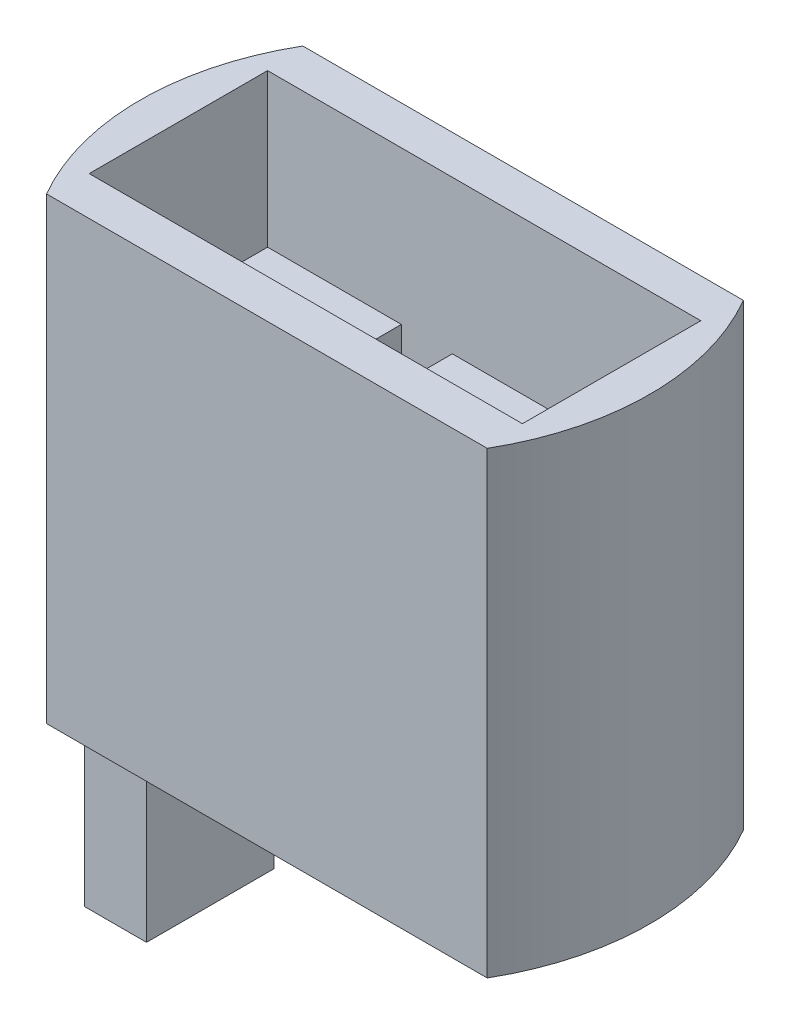
ISO-10303-21;
HEADER;
FILE_DESCRIPTION(('STEP AP214'),'2;1');
FILE_NAME('part.step','',(''),(''),'','','');
FILE_SCHEMA(('AUTOMOTIVE_DESIGN { 1 0 10303 214 1 1 1 1 }'));
ENDSEC;
DATA;
#1=APPLICATION_CONTEXT('core data for automotive mechanical design processes');
#2=APPLICATION_PROTOCOL_DEFINITION('international standard','automotive_design',2000,#1);
#3=PRODUCT_CONTEXT('',#1,'mechanical');
#4=PRODUCT('Part','Part','',(#3));
#5=PRODUCT_RELATED_PRODUCT_CATEGORY('part','',(#4));
#6=PRODUCT_DEFINITION_FORMATION('','',#4);
#7=PRODUCT_DEFINITION_CONTEXT('part definition',#1,'design');
#8=PRODUCT_DEFINITION('design','',#6,#7);
#9=PRODUCT_DEFINITION_SHAPE('','',#8);
#10=(LENGTH_UNIT() NAMED_UNIT(*) SI_UNIT(.MILLI.,.METRE.));
#11=(NAMED_UNIT(*) PLANE_ANGLE_UNIT() SI_UNIT($,.RADIAN.));
#12=(NAMED_UNIT(*) SI_UNIT($,.STERADIAN.) SOLID_ANGLE_UNIT());
#13=UNCERTAINTY_MEASURE_WITH_UNIT(LENGTH_MEASURE(1.E-05),#10,'distance_accuracy_value','');
#14=(GEOMETRIC_REPRESENTATION_CONTEXT(3) GLOBAL_UNCERTAINTY_ASSIGNED_CONTEXT((#13)) GLOBAL_UNIT_ASSIGNED_CONTEXT((#10,
#11,#12)) REPRESENTATION_CONTEXT('',''));
#15=CARTESIAN_POINT('',(0.,0.,0.));
#16=DIRECTION('',(0.,0.,1.));
#17=DIRECTION('',(1.,0.,0.));
#18=AXIS2_PLACEMENT_3D('',#15,#16,#17);
#19=CARTESIAN_POINT('',(-8.05,-8.,-2.5));
#20=DIRECTION('',(1.,0.,0.));
#21=DIRECTION('',(0.,0.,-1.));
#22=AXIS2_PLACEMENT_3D('',#19,#20,#21);
#23=PLANE('',#22);
#24=DIRECTION('',(0.,-1.,0.));
#25=VECTOR('',#24,1.);
#26=CARTESIAN_POINT('',(-8.05,-8.,1.5));
#27=LINE('',#26,#25);
#28=CARTESIAN_POINT('',(-8.05,-0.75,1.5));
#29=VERTEX_POINT('',#28);
#30=CARTESIAN_POINT('',(-8.05,-8.,1.5));
#31=VERTEX_POINT('',#30);
#32=EDGE_CURVE('E56',#29,#31,#27,.T.);
#33=ORIENTED_EDGE('',*,*,#32,.F.);
#34=DIRECTION('',(0.,0.,1.));
#35=VECTOR('',#34,1.);
#36=CARTESIAN_POINT('',(-8.05,-0.75,1.5));
#37=LINE('',#36,#35);
#38=CARTESIAN_POINT('',(-8.05,-0.75,-1.5));
#39=VERTEX_POINT('',#38);
#40=EDGE_CURVE('E464',#39,#29,#37,.T.);
#41=ORIENTED_EDGE('',*,*,#40,.F.);
#42=DIRECTION('',(0.,1.,0.));
#43=VECTOR('',#42,1.);
#44=CARTESIAN_POINT('',(-8.05,-0.75,-1.5));
#45=LINE('',#44,#43);
#46=CARTESIAN_POINT('',(-8.05,-8.,-1.5));
#47=VERTEX_POINT('',#46);
#48=EDGE_CURVE('E61',#47,#39,#45,.T.);
#49=ORIENTED_EDGE('',*,*,#48,.F.);
#50=DIRECTION('',(0.,0.,-1.));
#51=VECTOR('',#50,1.);
#52=CARTESIAN_POINT('',(-8.05,-8.,-2.5));
#53=LINE('',#52,#51);
#54=EDGE_CURVE('E203',#31,#47,#53,.T.);
#55=ORIENTED_EDGE('',*,*,#54,.F.);
#56=EDGE_LOOP('',(#33,#41,#49,#55));
#57=FACE_BOUND('',#56,.T.);
#58=ADVANCED_FACE('F41',(#57),#23,.F.);
#59=CARTESIAN_POINT('',(-8.05,-8.,-2.5));
#60=DIRECTION('',(0.,0.,1.));
#61=DIRECTION('',(1.,0.,0.));
#62=AXIS2_PLACEMENT_3D('',#59,#60,#61);
#63=PLANE('',#62);
#64=DIRECTION('',(1.,0.,0.));
#65=VECTOR('',#64,1.);
#66=CARTESIAN_POINT('',(-8.05,-8.,-2.5));
#67=LINE('',#66,#65);
#68=CARTESIAN_POINT('',(-9.68245836551854,-8.,-2.5));
#69=VERTEX_POINT('',#68);
#70=CARTESIAN_POINT('',(-7.25,-8.,-2.5));
#71=VERTEX_POINT('',#70);
#72=EDGE_CURVE('E193',#69,#71,#67,.T.);
#73=ORIENTED_EDGE('',*,*,#72,.F.);
#74=DIRECTION('',(0.,1.,0.));
#75=VECTOR('',#74,1.);
#76=CARTESIAN_POINT('',(-9.68245836551854,-8.001,-2.5));
#77=LINE('',#76,#75);
#78=CARTESIAN_POINT('',(-9.68245836551854,0.,-2.5));
#79=VERTEX_POINT('',#78);
#80=EDGE_CURVE('E176',#69,#79,#77,.T.);
#81=ORIENTED_EDGE('',*,*,#80,.T.);
#82=DIRECTION('',(1.,0.,0.));
#83=VECTOR('',#82,1.);
#84=CARTESIAN_POINT('',(-8.05,0.,-2.5));
#85=LINE('',#84,#83);
#86=CARTESIAN_POINT('',(-7.25,0.,-2.5));
#87=VERTEX_POINT('',#86);
#88=EDGE_CURVE('E214',#79,#87,#85,.T.);
#89=ORIENTED_EDGE('',*,*,#88,.T.);
#90=DIRECTION('',(0.,1.,0.));
#91=VECTOR('',#90,1.);
#92=CARTESIAN_POINT('',(-7.25,-8.,-2.5));
#93=LINE('',#92,#91);
#94=EDGE_CURVE('E11',#71,#87,#93,.T.);
#95=ORIENTED_EDGE('',*,*,#94,.F.);
#96=EDGE_LOOP('',(#73,#81,#89,#95));
#97=FACE_BOUND('',#96,.T.);
#98=ADVANCED_FACE('F199',(#97),#63,.F.);
#99=CARTESIAN_POINT('',(-7.25,-8.,-2.5));
#100=DIRECTION('',(-1.,0.,0.));
#101=DIRECTION('',(0.,0.,1.));
#102=AXIS2_PLACEMENT_3D('',#99,#100,#101);
#103=PLANE('',#102);
#104=DIRECTION('',(0.,0.,1.));
#105=VECTOR('',#104,1.);
#106=CARTESIAN_POINT('',(-7.25,0.,-2.5));
#107=LINE('',#106,#105);
#108=CARTESIAN_POINT('',(-7.25,0.,2.5));
#109=VERTEX_POINT('',#108);
#110=EDGE_CURVE('E217',#87,#109,#107,.T.);
#111=ORIENTED_EDGE('',*,*,#110,.T.);
#112=DIRECTION('',(0.,1.,0.));
#113=VECTOR('',#112,1.);
#114=CARTESIAN_POINT('',(-7.25,-8.,2.5));
#115=LINE('',#114,#113);
#116=CARTESIAN_POINT('',(-7.25,-8.,2.5));
#117=VERTEX_POINT('',#116);
#118=EDGE_CURVE('E49',#117,#109,#115,.T.);
#119=ORIENTED_EDGE('',*,*,#118,.F.);
#120=DIRECTION('',(0.,0.,1.));
#121=VECTOR('',#120,1.);
#122=CARTESIAN_POINT('',(-7.25,-8.,-2.5));
#123=LINE('',#122,#121);
#124=EDGE_CURVE('E202',#71,#117,#123,.T.);
#125=ORIENTED_EDGE('',*,*,#124,.F.);
#126=ORIENTED_EDGE('',*,*,#94,.T.);
#127=EDGE_LOOP('',(#111,#119,#125,#126));
#128=FACE_BOUND('',#127,.T.);
#129=ADVANCED_FACE('F423',(#128),#103,.F.);
#130=CARTESIAN_POINT('',(-8.05,-8.,2.5));
#131=DIRECTION('',(0.,0.,-1.));
#132=DIRECTION('',(-1.,0.,0.));
#133=AXIS2_PLACEMENT_3D('',#130,#131,#132);
#134=PLANE('',#133);
#135=DIRECTION('',(-1.,0.,0.));
#136=VECTOR('',#135,1.);
#137=CARTESIAN_POINT('',(-8.05,0.,2.5));
#138=LINE('',#137,#136);
#139=CARTESIAN_POINT('',(-9.68245836551854,0.,2.5));
#140=VERTEX_POINT('',#139);
#141=EDGE_CURVE('E208',#109,#140,#138,.T.);
#142=ORIENTED_EDGE('',*,*,#141,.T.);
#143=DIRECTION('',(0.,1.,0.));
#144=VECTOR('',#143,1.);
#145=CARTESIAN_POINT('',(-9.68245836551854,-8.001,2.5));
#146=LINE('',#145,#144);
#147=CARTESIAN_POINT('',(-9.68245836551854,-8.,2.5));
#148=VERTEX_POINT('',#147);
#149=EDGE_CURVE('E188',#148,#140,#146,.T.);
#150=ORIENTED_EDGE('',*,*,#149,.F.);
#151=DIRECTION('',(-1.,0.,0.));
#152=VECTOR('',#151,1.);
#153=CARTESIAN_POINT('',(-8.05,-8.,2.5));
#154=LINE('',#153,#152);
#155=EDGE_CURVE('E196',#117,#148,#154,.T.);
#156=ORIENTED_EDGE('',*,*,#155,.F.);
#157=ORIENTED_EDGE('',*,*,#118,.T.);
#158=EDGE_LOOP('',(#142,#150,#156,#157));
#159=FACE_BOUND('',#158,.T.);
#160=ADVANCED_FACE('F228',(#159),#134,.F.);
#161=CARTESIAN_POINT('',(0.,-8.,0.));
#162=DIRECTION('',(0.,1.,0.));
#163=DIRECTION('',(0.,0.,1.));
#164=AXIS2_PLACEMENT_3D('',#161,#162,#163);
#165=PLANE('',#164);
#166=DIRECTION('',(1.,0.,0.));
#167=VECTOR('',#166,1.);
#168=CARTESIAN_POINT('',(-9.25,-8.,-1.5));
#169=LINE('',#168,#167);
#170=CARTESIAN_POINT('',(-9.25,-8.,-1.5));
#171=VERTEX_POINT('',#170);
#172=EDGE_CURVE('E218',#171,#47,#169,.T.);
#173=ORIENTED_EDGE('',*,*,#172,.F.);
#174=DIRECTION('',(0.,0.,1.));
#175=VECTOR('',#174,1.);
#176=CARTESIAN_POINT('',(-9.25,-8.,-2.5));
#177=LINE('',#176,#175);
#178=CARTESIAN_POINT('',(-9.25,-8.,1.5));
#179=VERTEX_POINT('',#178);
#180=EDGE_CURVE('E265',#171,#179,#177,.T.);
#181=ORIENTED_EDGE('',*,*,#180,.T.);
#182=DIRECTION('',(1.,0.,0.));
#183=VECTOR('',#182,1.);
#184=CARTESIAN_POINT('',(-9.25,-8.,1.5));
#185=LINE('',#184,#183);
#186=EDGE_CURVE('E473',#179,#31,#185,.T.);
#187=ORIENTED_EDGE('',*,*,#186,.T.);
#188=ORIENTED_EDGE('',*,*,#54,.T.);
#189=EDGE_LOOP('',(#173,#181,#187,#188));
#190=FACE_BOUND('',#189,.T.);
#191=ORIENTED_EDGE('',*,*,#155,.T.);
#192=CARTESIAN_POINT('',(-6.26235174827627E-13,-8.,0.));
#193=DIRECTION('',(0.,1.,0.));
#194=DIRECTION('',(0.,0.,1.));
#195=AXIS2_PLACEMENT_3D('',#192,#193,#194);
#196=CIRCLE('',#195,9.99999999999939);
#197=EDGE_CURVE('E179',#69,#148,#196,.T.);
#198=ORIENTED_EDGE('',*,*,#197,.F.);
#199=ORIENTED_EDGE('',*,*,#72,.T.);
#200=ORIENTED_EDGE('',*,*,#124,.T.);
#201=EDGE_LOOP('',(#191,#198,#199,#200));
#202=FACE_BOUND('',#201,.T.);
#203=ADVANCED_FACE('F192',(#190,#202),#165,.F.);
#204=CARTESIAN_POINT('',(-9.25,-0.75,-1.5));
#205=DIRECTION('',(0.,0.,-1.));
#206=DIRECTION('',(0.,1.,0.));
#207=AXIS2_PLACEMENT_3D('',#204,#205,#206);
#208=PLANE('',#207);
#209=ORIENTED_EDGE('',*,*,#48,.T.);
#210=DIRECTION('',(1.,0.,0.));
#211=VECTOR('',#210,1.);
#212=CARTESIAN_POINT('',(-9.25,-0.75,-1.5));
#213=LINE('',#212,#211);
#214=CARTESIAN_POINT('',(-9.25,-0.75,-1.5));
#215=VERTEX_POINT('',#214);
#216=EDGE_CURVE('E485',#215,#39,#213,.T.);
#217=ORIENTED_EDGE('',*,*,#216,.F.);
#218=DIRECTION('',(0.,1.,0.));
#219=VECTOR('',#218,1.);
#220=CARTESIAN_POINT('',(-9.25,-0.75,-1.5));
#221=LINE('',#220,#219);
#222=EDGE_CURVE('E457',#171,#215,#221,.T.);
#223=ORIENTED_EDGE('',*,*,#222,.F.);
#224=ORIENTED_EDGE('',*,*,#172,.T.);
#225=EDGE_LOOP('',(#209,#217,#223,#224));
#226=FACE_BOUND('',#225,.T.);
#227=ADVANCED_FACE('F433',(#226),#208,.F.);
#228=CARTESIAN_POINT('',(-9.25,-0.75,1.5));
#229=DIRECTION('',(0.,1.,0.));
#230=DIRECTION('',(0.,0.,1.));
#231=AXIS2_PLACEMENT_3D('',#228,#229,#230);
#232=PLANE('',#231);
#233=ORIENTED_EDGE('',*,*,#40,.T.);
#234=DIRECTION('',(1.,0.,0.));
#235=VECTOR('',#234,1.);
#236=CARTESIAN_POINT('',(-9.25,-0.75,1.5));
#237=LINE('',#236,#235);
#238=CARTESIAN_POINT('',(-9.25,-0.75,1.5));
#239=VERTEX_POINT('',#238);
#240=EDGE_CURVE('E481',#239,#29,#237,.T.);
#241=ORIENTED_EDGE('',*,*,#240,.F.);
#242=DIRECTION('',(0.,0.,1.));
#243=VECTOR('',#242,1.);
#244=CARTESIAN_POINT('',(-9.25,-0.75,1.5));
#245=LINE('',#244,#243);
#246=EDGE_CURVE('E469',#215,#239,#245,.T.);
#247=ORIENTED_EDGE('',*,*,#246,.F.);
#248=ORIENTED_EDGE('',*,*,#216,.T.);
#249=EDGE_LOOP('',(#233,#241,#247,#248));
#250=FACE_BOUND('',#249,.T.);
#251=ADVANCED_FACE('F437',(#250),#232,.F.);
#252=CARTESIAN_POINT('',(-9.25,-8.,1.5));
#253=DIRECTION('',(0.,0.,1.));
#254=DIRECTION('',(1.,0.,0.));
#255=AXIS2_PLACEMENT_3D('',#252,#253,#254);
#256=PLANE('',#255);
#257=ORIENTED_EDGE('',*,*,#32,.T.);
#258=ORIENTED_EDGE('',*,*,#186,.F.);
#259=DIRECTION('',(0.,-1.,0.));
#260=VECTOR('',#259,1.);
#261=CARTESIAN_POINT('',(-9.25,-8.,1.5));
#262=LINE('',#261,#260);
#263=EDGE_CURVE('E459',#239,#179,#262,.T.);
#264=ORIENTED_EDGE('',*,*,#263,.F.);
#265=ORIENTED_EDGE('',*,*,#240,.T.);
#266=EDGE_LOOP('',(#257,#258,#264,#265));
#267=FACE_BOUND('',#266,.T.);
#268=ADVANCED_FACE('F441',(#267),#256,.F.);
#269=CARTESIAN_POINT('',(-9.25,0.,0.));
#270=DIRECTION('',(1.,0.,0.));
#271=DIRECTION('',(0.,0.,-1.));
#272=AXIS2_PLACEMENT_3D('',#269,#270,#271);
#273=PLANE('',#272);
#274=ORIENTED_EDGE('',*,*,#180,.F.);
#275=ORIENTED_EDGE('',*,*,#222,.T.);
#276=ORIENTED_EDGE('',*,*,#246,.T.);
#277=ORIENTED_EDGE('',*,*,#263,.T.);
#278=EDGE_LOOP('',(#274,#275,#276,#277));
#279=FACE_BOUND('',#278,.T.);
#280=ADVANCED_FACE('F445',(#279),#273,.T.);
#281=CARTESIAN_POINT('',(0.,18.,0.));
#282=DIRECTION('',(0.,-1.,0.));
#283=DIRECTION('',(0.,0.,-1.));
#284=AXIS2_PLACEMENT_3D('',#281,#282,#283);
#285=CYLINDRICAL_SURFACE('',#284,10.);
#286=CARTESIAN_POINT('',(0.,18.,0.));
#287=DIRECTION('',(0.,1.,0.));
#288=DIRECTION('',(0.,0.,1.));
#289=AXIS2_PLACEMENT_3D('',#286,#287,#288);
#290=CIRCLE('',#289,10.);
#291=CARTESIAN_POINT('',(8.64463271574625,18.,5.02695983770008));
#292=VERTEX_POINT('',#291);
#293=CARTESIAN_POINT('',(8.64463271574627,18.,-5.02695983770008));
#294=VERTEX_POINT('',#293);
#295=EDGE_CURVE('E258',#292,#294,#290,.T.);
#296=ORIENTED_EDGE('',*,*,#295,.F.);
#297=DIRECTION('',(0.,-1.,0.));
#298=VECTOR('',#297,1.);
#299=CARTESIAN_POINT('',(8.64463271574625,25.,5.02695983770008));
#300=LINE('',#299,#298);
#301=CARTESIAN_POINT('',(8.64463271574625,0.,5.02695983770008));
#302=VERTEX_POINT('',#301);
#303=EDGE_CURVE('E351',#292,#302,#300,.T.);
#304=ORIENTED_EDGE('',*,*,#303,.T.);
#305=CARTESIAN_POINT('',(0.,0.,0.));
#306=DIRECTION('',(0.,1.,0.));
#307=DIRECTION('',(0.,0.,1.));
#308=AXIS2_PLACEMENT_3D('',#305,#306,#307);
#309=CIRCLE('',#308,10.);
#310=CARTESIAN_POINT('',(8.64463271574625,0.,-5.02695983770008));
#311=VERTEX_POINT('',#310);
#312=EDGE_CURVE('E243',#302,#311,#309,.T.);
#313=ORIENTED_EDGE('',*,*,#312,.T.);
#314=DIRECTION('',(0.,-1.,0.));
#315=VECTOR('',#314,1.);
#316=CARTESIAN_POINT('',(8.64463271574627,25.,-5.02695983770008));
#317=LINE('',#316,#315);
#318=EDGE_CURVE('E352',#294,#311,#317,.T.);
#319=ORIENTED_EDGE('',*,*,#318,.F.);
#320=EDGE_LOOP('',(#296,#304,#313,#319));
#321=FACE_BOUND('',#320,.T.);
#322=ADVANCED_FACE('F417',(#321),#285,.T.);
#323=CARTESIAN_POINT('',(0.,12.,0.));
#324=DIRECTION('',(0.,-1.,0.));
#325=DIRECTION('',(0.,0.,-1.));
#326=AXIS2_PLACEMENT_3D('',#323,#324,#325);
#327=PLANE('',#326);
#328=DIRECTION('',(0.,0.,-1.));
#329=VECTOR('',#328,1.);
#330=CARTESIAN_POINT('',(-1.25,12.,-3.5));
#331=LINE('',#330,#329);
#332=CARTESIAN_POINT('',(-1.25,12.,3.5));
#333=VERTEX_POINT('',#332);
#334=CARTESIAN_POINT('',(-1.25,12.,-3.5));
#335=VERTEX_POINT('',#334);
#336=EDGE_CURVE('E327',#333,#335,#331,.T.);
#337=ORIENTED_EDGE('',*,*,#336,.F.);
#338=DIRECTION('',(1.,0.,0.));
#339=VECTOR('',#338,1.);
#340=CARTESIAN_POINT('',(-8.5,12.,3.5));
#341=LINE('',#340,#339);
#342=CARTESIAN_POINT('',(8.5,12.,3.5));
#343=VERTEX_POINT('',#342);
#344=EDGE_CURVE('E306',#333,#343,#341,.T.);
#345=ORIENTED_EDGE('',*,*,#344,.T.);
#346=DIRECTION('',(0.,0.,-1.));
#347=VECTOR('',#346,1.);
#348=CARTESIAN_POINT('',(8.5,12.,3.5));
#349=LINE('',#348,#347);
#350=CARTESIAN_POINT('',(8.5,12.,-3.5));
#351=VERTEX_POINT('',#350);
#352=EDGE_CURVE('E298',#343,#351,#349,.T.);
#353=ORIENTED_EDGE('',*,*,#352,.T.);
#354=DIRECTION('',(-1.,0.,0.));
#355=VECTOR('',#354,1.);
#356=CARTESIAN_POINT('',(-8.5,12.,-3.5));
#357=LINE('',#356,#355);
#358=EDGE_CURVE('E272',#351,#335,#357,.T.);
#359=ORIENTED_EDGE('',*,*,#358,.T.);
#360=EDGE_LOOP('',(#337,#345,#353,#359));
#361=FACE_BOUND('',#360,.T.);
#362=ADVANCED_FACE('F401',(#361),#327,.F.);
#363=DIRECTION('',(0.,0.,1.));
#364=VECTOR('',#363,1.);
#365=CARTESIAN_POINT('',(-3.25,12.,-3.5));
#366=LINE('',#365,#364);
#367=CARTESIAN_POINT('',(-3.25,12.,-3.5));
#368=VERTEX_POINT('',#367);
#369=CARTESIAN_POINT('',(-3.25,12.,3.5));
#370=VERTEX_POINT('',#369);
#371=EDGE_CURVE('E322',#368,#370,#366,.T.);
#372=ORIENTED_EDGE('',*,*,#371,.F.);
#373=CARTESIAN_POINT('',(-8.5,12.,-3.5));
#374=VERTEX_POINT('',#373);
#375=EDGE_CURVE('E297',#368,#374,#357,.T.);
#376=ORIENTED_EDGE('',*,*,#375,.T.);
#377=DIRECTION('',(0.,0.,1.));
#378=VECTOR('',#377,1.);
#379=CARTESIAN_POINT('',(-8.5,12.,3.5));
#380=LINE('',#379,#378);
#381=CARTESIAN_POINT('',(-8.5,12.,3.5));
#382=VERTEX_POINT('',#381);
#383=EDGE_CURVE('E281',#374,#382,#380,.T.);
#384=ORIENTED_EDGE('',*,*,#383,.T.);
#385=EDGE_CURVE('E302',#382,#370,#341,.T.);
#386=ORIENTED_EDGE('',*,*,#385,.T.);
#387=EDGE_LOOP('',(#372,#376,#384,#386));
#388=FACE_BOUND('',#387,.T.);
#389=ADVANCED_FACE('F375',(#388),#327,.F.);
#390=CARTESIAN_POINT('',(-8.64463271574623,0.,-5.02695983770015));
#391=VERTEX_POINT('',#390);
#392=EDGE_CURVE('E183',#391,#79,#309,.T.);
#393=ORIENTED_EDGE('',*,*,#392,.T.);
#394=ORIENTED_EDGE('',*,*,#80,.F.);
#395=ORIENTED_EDGE('',*,*,#197,.T.);
#396=ORIENTED_EDGE('',*,*,#149,.T.);
#397=CARTESIAN_POINT('',(-8.64463271574625,0.,5.02695983770008));
#398=VERTEX_POINT('',#397);
#399=EDGE_CURVE('E235',#140,#398,#309,.T.);
#400=ORIENTED_EDGE('',*,*,#399,.T.);
#401=DIRECTION('',(0.,-1.,0.));
#402=VECTOR('',#401,1.);
#403=CARTESIAN_POINT('',(-8.64463271574625,25.,5.02695983770008));
#404=LINE('',#403,#402);
#405=CARTESIAN_POINT('',(-8.64463271574625,18.,5.02695983770008));
#406=VERTEX_POINT('',#405);
#407=EDGE_CURVE('E361',#406,#398,#404,.T.);
#408=ORIENTED_EDGE('',*,*,#407,.F.);
#409=CARTESIAN_POINT('',(-8.64463271574623,18.,-5.02695983770015));
#410=VERTEX_POINT('',#409);
#411=EDGE_CURVE('E252',#410,#406,#290,.T.);
#412=ORIENTED_EDGE('',*,*,#411,.F.);
#413=DIRECTION('',(0.,-1.,0.));
#414=VECTOR('',#413,1.);
#415=CARTESIAN_POINT('',(-8.64463271574623,25.,-5.02695983770015));
#416=LINE('',#415,#414);
#417=EDGE_CURVE('E355',#410,#391,#416,.T.);
#418=ORIENTED_EDGE('',*,*,#417,.T.);
#419=EDGE_LOOP('',(#393,#394,#395,#396,#400,#408,#412,#418));
#420=FACE_BOUND('',#419,.T.);
#421=ADVANCED_FACE('F178',(#420),#285,.T.);
#422=CARTESIAN_POINT('',(0.,18.,0.));
#423=DIRECTION('',(0.,1.,0.));
#424=DIRECTION('',(0.,0.,1.));
#425=AXIS2_PLACEMENT_3D('',#422,#423,#424);
#426=PLANE('',#425);
#427=DIRECTION('',(-1.,0.,0.));
#428=VECTOR('',#427,1.);
#429=CARTESIAN_POINT('',(0.,18.,5.02695983770008));
#430=LINE('',#429,#428);
#431=EDGE_CURVE('E331',#292,#406,#430,.T.);
#432=ORIENTED_EDGE('',*,*,#431,.F.);
#433=ORIENTED_EDGE('',*,*,#295,.T.);
#434=DIRECTION('',(1.,0.,0.));
#435=VECTOR('',#434,1.);
#436=CARTESIAN_POINT('',(0.,18.,-5.02695983770012));
#437=LINE('',#436,#435);
#438=EDGE_CURVE('E348',#410,#294,#437,.T.);
#439=ORIENTED_EDGE('',*,*,#438,.F.);
#440=ORIENTED_EDGE('',*,*,#411,.T.);
#441=EDGE_LOOP('',(#432,#433,#439,#440));
#442=FACE_BOUND('',#441,.T.);
#443=DIRECTION('',(0.,0.,1.));
#444=VECTOR('',#443,1.);
#445=CARTESIAN_POINT('',(-8.5,18.,3.5));
#446=LINE('',#445,#444);
#447=CARTESIAN_POINT('',(-8.5,18.,-3.5));
#448=VERTEX_POINT('',#447);
#449=CARTESIAN_POINT('',(-8.5,18.,3.5));
#450=VERTEX_POINT('',#449);
#451=EDGE_CURVE('E290',#448,#450,#446,.T.);
#452=ORIENTED_EDGE('',*,*,#451,.F.);
#453=DIRECTION('',(-1.,0.,0.));
#454=VECTOR('',#453,1.);
#455=CARTESIAN_POINT('',(-8.5,18.,-3.5));
#456=LINE('',#455,#454);
#457=CARTESIAN_POINT('',(8.5,18.,-3.5));
#458=VERTEX_POINT('',#457);
#459=EDGE_CURVE('E277',#458,#448,#456,.T.);
#460=ORIENTED_EDGE('',*,*,#459,.F.);
#461=DIRECTION('',(0.,0.,-1.));
#462=VECTOR('',#461,1.);
#463=CARTESIAN_POINT('',(8.5,18.,3.5));
#464=LINE('',#463,#462);
#465=CARTESIAN_POINT('',(8.5,18.,3.5));
#466=VERTEX_POINT('',#465);
#467=EDGE_CURVE('E282',#466,#458,#464,.T.);
#468=ORIENTED_EDGE('',*,*,#467,.F.);
#469=DIRECTION('',(1.,0.,0.));
#470=VECTOR('',#469,1.);
#471=CARTESIAN_POINT('',(-8.5,18.,3.5));
#472=LINE('',#471,#470);
#473=EDGE_CURVE('E286',#450,#466,#472,.T.);
#474=ORIENTED_EDGE('',*,*,#473,.F.);
#475=EDGE_LOOP('',(#452,#460,#468,#474));
#476=FACE_BOUND('',#475,.T.);
#477=ADVANCED_FACE('F408',(#442,#476),#426,.T.);
#478=CARTESIAN_POINT('',(0.,0.,0.));
#479=DIRECTION('',(0.,1.,0.));
#480=DIRECTION('',(0.,0.,1.));
#481=AXIS2_PLACEMENT_3D('',#478,#479,#480);
#482=PLANE('',#481);
#483=ORIENTED_EDGE('',*,*,#88,.F.);
#484=ORIENTED_EDGE('',*,*,#392,.F.);
#485=DIRECTION('',(-1.,0.,0.));
#486=VECTOR('',#485,1.);
#487=CARTESIAN_POINT('',(-8.64463271574623,0.,-5.02695983770015));
#488=LINE('',#487,#486);
#489=EDGE_CURVE('E356',#311,#391,#488,.T.);
#490=ORIENTED_EDGE('',*,*,#489,.F.);
#491=ORIENTED_EDGE('',*,*,#312,.F.);
#492=DIRECTION('',(1.,0.,0.));
#493=VECTOR('',#492,1.);
#494=CARTESIAN_POINT('',(-8.64463271574625,0.,5.02695983770008));
#495=LINE('',#494,#493);
#496=EDGE_CURVE('E237',#398,#302,#495,.T.);
#497=ORIENTED_EDGE('',*,*,#496,.F.);
#498=ORIENTED_EDGE('',*,*,#399,.F.);
#499=ORIENTED_EDGE('',*,*,#141,.F.);
#500=ORIENTED_EDGE('',*,*,#110,.F.);
#501=EDGE_LOOP('',(#483,#484,#490,#491,#497,#498,#499,#500));
#502=FACE_BOUND('',#501,.T.);
#503=ADVANCED_FACE('F233',(#502),#482,.F.);
#504=CARTESIAN_POINT('',(-8.5,12.,3.5));
#505=DIRECTION('',(-1.,0.,0.));
#506=DIRECTION('',(0.,0.,1.));
#507=AXIS2_PLACEMENT_3D('',#504,#505,#506);
#508=PLANE('',#507);
#509=ORIENTED_EDGE('',*,*,#451,.T.);
#510=DIRECTION('',(0.,1.,0.));
#511=VECTOR('',#510,1.);
#512=CARTESIAN_POINT('',(-8.5,12.,3.5));
#513=LINE('',#512,#511);
#514=EDGE_CURVE('E267',#382,#450,#513,.T.);
#515=ORIENTED_EDGE('',*,*,#514,.F.);
#516=ORIENTED_EDGE('',*,*,#383,.F.);
#517=DIRECTION('',(0.,1.,0.));
#518=VECTOR('',#517,1.);
#519=CARTESIAN_POINT('',(-8.5,12.,-3.5));
#520=LINE('',#519,#518);
#521=EDGE_CURVE('E241',#374,#448,#520,.T.);
#522=ORIENTED_EDGE('',*,*,#521,.T.);
#523=EDGE_LOOP('',(#509,#515,#516,#522));
#524=FACE_BOUND('',#523,.T.);
#525=ADVANCED_FACE('F382',(#524),#508,.F.);
#526=CARTESIAN_POINT('',(-8.5,12.,-3.5));
#527=DIRECTION('',(0.,0.,-1.));
#528=DIRECTION('',(-1.,0.,0.));
#529=AXIS2_PLACEMENT_3D('',#526,#527,#528);
#530=PLANE('',#529);
#531=ORIENTED_EDGE('',*,*,#459,.T.);
#532=ORIENTED_EDGE('',*,*,#521,.F.);
#533=ORIENTED_EDGE('',*,*,#375,.F.);
#534=DIRECTION('',(0.,1.,0.));
#535=VECTOR('',#534,1.);
#536=CARTESIAN_POINT('',(-3.25,8.,-3.5));
#537=LINE('',#536,#535);
#538=CARTESIAN_POINT('',(-3.25,8.,-3.5));
#539=VERTEX_POINT('',#538);
#540=EDGE_CURVE('E313',#539,#368,#537,.T.);
#541=ORIENTED_EDGE('',*,*,#540,.F.);
#542=DIRECTION('',(-1.,0.,0.));
#543=VECTOR('',#542,1.);
#544=CARTESIAN_POINT('',(-1.25,8.,-3.5));
#545=LINE('',#544,#543);
#546=CARTESIAN_POINT('',(-1.25,8.,-3.5));
#547=VERTEX_POINT('',#546);
#548=EDGE_CURVE('E339',#547,#539,#545,.T.);
#549=ORIENTED_EDGE('',*,*,#548,.F.);
#550=DIRECTION('',(0.,1.,0.));
#551=VECTOR('',#550,1.);
#552=CARTESIAN_POINT('',(-1.25,8.,-3.5));
#553=LINE('',#552,#551);
#554=EDGE_CURVE('E310',#547,#335,#553,.T.);
#555=ORIENTED_EDGE('',*,*,#554,.T.);
#556=ORIENTED_EDGE('',*,*,#358,.F.);
#557=DIRECTION('',(0.,1.,0.));
#558=VECTOR('',#557,1.);
#559=CARTESIAN_POINT('',(8.5,12.,-3.5));
#560=LINE('',#559,#558);
#561=EDGE_CURVE('E246',#351,#458,#560,.T.);
#562=ORIENTED_EDGE('',*,*,#561,.T.);
#563=EDGE_LOOP('',(#531,#532,#533,#541,#549,#555,#556,#562));
#564=FACE_BOUND('',#563,.T.);
#565=ADVANCED_FACE('F378',(#564),#530,.F.);
#566=CARTESIAN_POINT('',(8.5,12.,3.5));
#567=DIRECTION('',(1.,0.,0.));
#568=DIRECTION('',(0.,0.,-1.));
#569=AXIS2_PLACEMENT_3D('',#566,#567,#568);
#570=PLANE('',#569);
#571=ORIENTED_EDGE('',*,*,#467,.T.);
#572=ORIENTED_EDGE('',*,*,#561,.F.);
#573=ORIENTED_EDGE('',*,*,#352,.F.);
#574=DIRECTION('',(0.,1.,0.));
#575=VECTOR('',#574,1.);
#576=CARTESIAN_POINT('',(8.5,12.,3.5));
#577=LINE('',#576,#575);
#578=EDGE_CURVE('E271',#343,#466,#577,.T.);
#579=ORIENTED_EDGE('',*,*,#578,.T.);
#580=EDGE_LOOP('',(#571,#572,#573,#579));
#581=FACE_BOUND('',#580,.T.);
#582=ADVANCED_FACE('F405',(#581),#570,.F.);
#583=CARTESIAN_POINT('',(-8.5,12.,3.5));
#584=DIRECTION('',(0.,0.,1.));
#585=DIRECTION('',(1.,0.,0.));
#586=AXIS2_PLACEMENT_3D('',#583,#584,#585);
#587=PLANE('',#586);
#588=ORIENTED_EDGE('',*,*,#473,.T.);
#589=ORIENTED_EDGE('',*,*,#578,.F.);
#590=ORIENTED_EDGE('',*,*,#344,.F.);
#591=DIRECTION('',(0.,1.,0.));
#592=VECTOR('',#591,1.);
#593=CARTESIAN_POINT('',(-1.25,8.,3.5));
#594=LINE('',#593,#592);
#595=CARTESIAN_POINT('',(-1.25,8.,3.5));
#596=VERTEX_POINT('',#595);
#597=EDGE_CURVE('E293',#596,#333,#594,.T.);
#598=ORIENTED_EDGE('',*,*,#597,.F.);
#599=DIRECTION('',(1.,0.,0.));
#600=VECTOR('',#599,1.);
#601=CARTESIAN_POINT('',(-1.25,8.,3.5));
#602=LINE('',#601,#600);
#603=CARTESIAN_POINT('',(-3.25,8.,3.5));
#604=VERTEX_POINT('',#603);
#605=EDGE_CURVE('E314',#604,#596,#602,.T.);
#606=ORIENTED_EDGE('',*,*,#605,.F.);
#607=DIRECTION('',(0.,1.,0.));
#608=VECTOR('',#607,1.);
#609=CARTESIAN_POINT('',(-3.25,8.,3.5));
#610=LINE('',#609,#608);
#611=EDGE_CURVE('E317',#604,#370,#610,.T.);
#612=ORIENTED_EDGE('',*,*,#611,.T.);
#613=ORIENTED_EDGE('',*,*,#385,.F.);
#614=ORIENTED_EDGE('',*,*,#514,.T.);
#615=EDGE_LOOP('',(#588,#589,#590,#598,#606,#612,#613,#614));
#616=FACE_BOUND('',#615,.T.);
#617=ADVANCED_FACE('F386',(#616),#587,.F.);
#618=CARTESIAN_POINT('',(-1.25,8.,-3.5));
#619=DIRECTION('',(1.,0.,0.));
#620=DIRECTION('',(0.,0.,-1.));
#621=AXIS2_PLACEMENT_3D('',#618,#619,#620);
#622=PLANE('',#621);
#623=ORIENTED_EDGE('',*,*,#336,.T.);
#624=ORIENTED_EDGE('',*,*,#554,.F.);
#625=DIRECTION('',(0.,0.,-1.));
#626=VECTOR('',#625,1.);
#627=CARTESIAN_POINT('',(-1.25,8.,-3.5));
#628=LINE('',#627,#626);
#629=EDGE_CURVE('E326',#596,#547,#628,.T.);
#630=ORIENTED_EDGE('',*,*,#629,.F.);
#631=ORIENTED_EDGE('',*,*,#597,.T.);
#632=EDGE_LOOP('',(#623,#624,#630,#631));
#633=FACE_BOUND('',#632,.T.);
#634=ADVANCED_FACE('F397',(#633),#622,.F.);
#635=CARTESIAN_POINT('',(-3.25,8.,-3.5));
#636=DIRECTION('',(-1.,0.,0.));
#637=DIRECTION('',(0.,0.,1.));
#638=AXIS2_PLACEMENT_3D('',#635,#636,#637);
#639=PLANE('',#638);
#640=ORIENTED_EDGE('',*,*,#371,.T.);
#641=ORIENTED_EDGE('',*,*,#611,.F.);
#642=DIRECTION('',(0.,0.,1.));
#643=VECTOR('',#642,1.);
#644=CARTESIAN_POINT('',(-3.25,8.,-3.5));
#645=LINE('',#644,#643);
#646=EDGE_CURVE('E335',#539,#604,#645,.T.);
#647=ORIENTED_EDGE('',*,*,#646,.F.);
#648=ORIENTED_EDGE('',*,*,#540,.T.);
#649=EDGE_LOOP('',(#640,#641,#647,#648));
#650=FACE_BOUND('',#649,.T.);
#651=ADVANCED_FACE('F390',(#650),#639,.F.);
#652=CARTESIAN_POINT('',(0.,8.,0.));
#653=DIRECTION('',(0.,-1.,0.));
#654=DIRECTION('',(0.,0.,-1.));
#655=AXIS2_PLACEMENT_3D('',#652,#653,#654);
#656=PLANE('',#655);
#657=ORIENTED_EDGE('',*,*,#629,.T.);
#658=ORIENTED_EDGE('',*,*,#548,.T.);
#659=ORIENTED_EDGE('',*,*,#646,.T.);
#660=ORIENTED_EDGE('',*,*,#605,.T.);
#661=EDGE_LOOP('',(#657,#658,#659,#660));
#662=FACE_BOUND('',#661,.T.);
#663=ADVANCED_FACE('F395',(#662),#656,.F.);
#664=CARTESIAN_POINT('',(-8.64463271574623,25.,-5.02695983770015));
#665=DIRECTION('',(0.,0.,1.));
#666=DIRECTION('',(1.,0.,0.));
#667=AXIS2_PLACEMENT_3D('',#664,#665,#666);
#668=PLANE('',#667);
#669=ORIENTED_EDGE('',*,*,#438,.T.);
#670=ORIENTED_EDGE('',*,*,#318,.T.);
#671=ORIENTED_EDGE('',*,*,#489,.T.);
#672=ORIENTED_EDGE('',*,*,#417,.F.);
#673=EDGE_LOOP('',(#669,#670,#671,#672));
#674=FACE_BOUND('',#673,.T.);
#675=ADVANCED_FACE('F500',(#674),#668,.F.);
#676=CARTESIAN_POINT('',(-8.64463271574625,25.,5.02695983770008));
#677=DIRECTION('',(0.,0.,-1.));
#678=DIRECTION('',(-1.,0.,0.));
#679=AXIS2_PLACEMENT_3D('',#676,#677,#678);
#680=PLANE('',#679);
#681=ORIENTED_EDGE('',*,*,#431,.T.);
#682=ORIENTED_EDGE('',*,*,#407,.T.);
#683=ORIENTED_EDGE('',*,*,#496,.T.);
#684=ORIENTED_EDGE('',*,*,#303,.F.);
#685=EDGE_LOOP('',(#681,#682,#683,#684));
#686=FACE_BOUND('',#685,.T.);
#687=ADVANCED_FACE('F497',(#686),#680,.F.);
#688=CLOSED_SHELL('',(#58,#98,#129,#160,#203,#227,#251,#268,#280,#322,#362,#389,#421,#477,#503,
#525,#565,#582,#617,#634,#651,#663,#675,#687));
#689=MANIFOLD_SOLID_BREP('B2',#688);
#690=ADVANCED_BREP_SHAPE_REPRESENTATION('',(#18,#689),#14);
#691=SHAPE_DEFINITION_REPRESENTATION(#9,#690);
ENDSEC;
END-ISO-10303-21;
